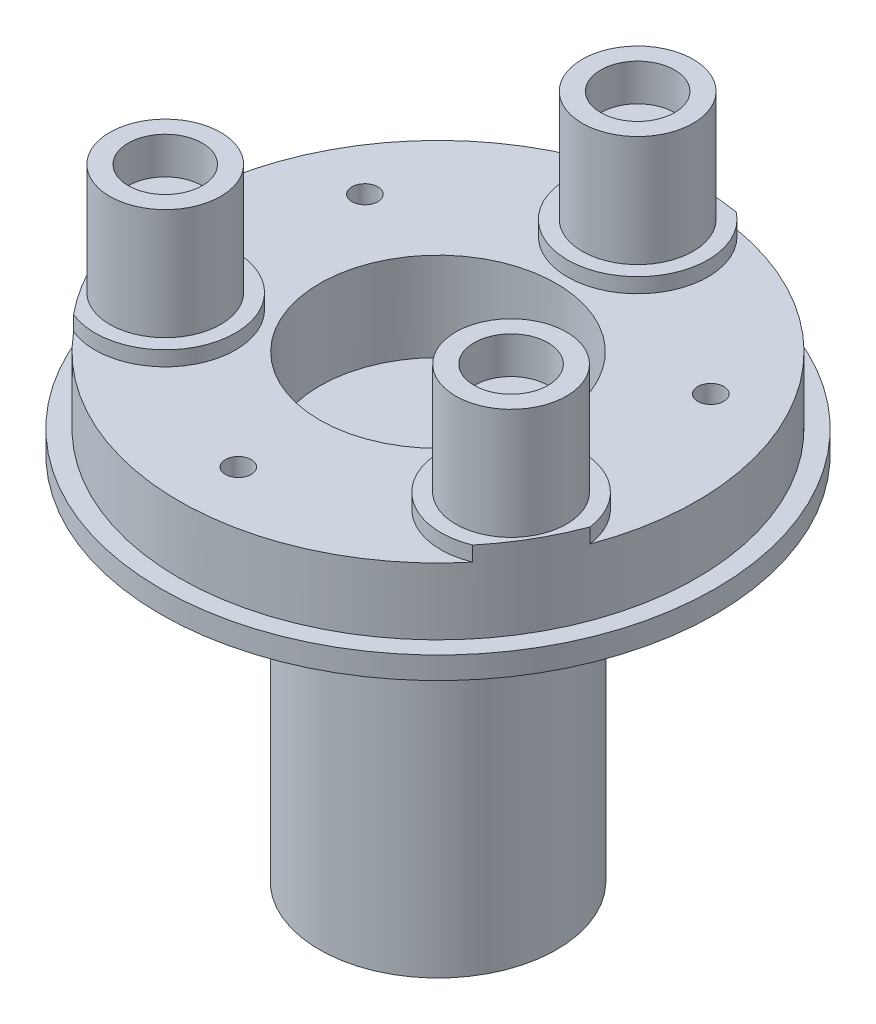
ISO-10303-21;
HEADER;
FILE_DESCRIPTION(('STEP AP214'),'2;1');
FILE_NAME('part.step','',(''),(''),'','','');
FILE_SCHEMA(('AUTOMOTIVE_DESIGN { 1 0 10303 214 1 1 1 1 }'));
ENDSEC;
DATA;
#1=APPLICATION_CONTEXT('core data for automotive mechanical design processes');
#2=APPLICATION_PROTOCOL_DEFINITION('international standard','automotive_design',2000,#1);
#3=PRODUCT_CONTEXT('',#1,'mechanical');
#4=PRODUCT('Part','Part','',(#3));
#5=PRODUCT_RELATED_PRODUCT_CATEGORY('part','',(#4));
#6=PRODUCT_DEFINITION_FORMATION('','',#4);
#7=PRODUCT_DEFINITION_CONTEXT('part definition',#1,'design');
#8=PRODUCT_DEFINITION('design','',#6,#7);
#9=PRODUCT_DEFINITION_SHAPE('','',#8);
#10=(LENGTH_UNIT() NAMED_UNIT(*) SI_UNIT(.MILLI.,.METRE.));
#11=(NAMED_UNIT(*) PLANE_ANGLE_UNIT() SI_UNIT($,.RADIAN.));
#12=(NAMED_UNIT(*) SI_UNIT($,.STERADIAN.) SOLID_ANGLE_UNIT());
#13=UNCERTAINTY_MEASURE_WITH_UNIT(LENGTH_MEASURE(1.E-05),#10,'distance_accuracy_value','');
#14=(GEOMETRIC_REPRESENTATION_CONTEXT(3) GLOBAL_UNCERTAINTY_ASSIGNED_CONTEXT((#13)) GLOBAL_UNIT_ASSIGNED_CONTEXT((#10,
#11,#12)) REPRESENTATION_CONTEXT('',''));
#15=CARTESIAN_POINT('',(0.,0.,0.));
#16=DIRECTION('',(0.,0.,1.));
#17=DIRECTION('',(1.,0.,0.));
#18=AXIS2_PLACEMENT_3D('',#15,#16,#17);
#19=CARTESIAN_POINT('',(0.,0.,0.));
#20=DIRECTION('',(0.,1.,0.));
#21=DIRECTION('',(0.,0.,1.));
#22=AXIS2_PLACEMENT_3D('',#19,#20,#21);
#23=CYLINDRICAL_SURFACE('',#22,16.);
#24=CARTESIAN_POINT('',(0.,12.,0.));
#25=DIRECTION('',(0.,1.,0.));
#26=DIRECTION('',(0.,0.,1.));
#27=AXIS2_PLACEMENT_3D('',#24,#25,#26);
#28=CIRCLE('',#27,16.);
#29=CARTESIAN_POINT('',(0.,12.,16.));
#30=VERTEX_POINT('',#29);
#31=EDGE_CURVE('E135',#30,#30,#28,.T.);
#32=ORIENTED_EDGE('',*,*,#31,.T.);
#33=EDGE_LOOP('',(#32));
#34=FACE_BOUND('',#33,.T.);
#35=CARTESIAN_POINT('',(0.,0.,0.));
#36=DIRECTION('',(0.,-1.,0.));
#37=DIRECTION('',(0.,0.,-1.));
#38=AXIS2_PLACEMENT_3D('',#35,#36,#37);
#39=CIRCLE('',#38,16.);
#40=CARTESIAN_POINT('',(0.,0.,-16.));
#41=VERTEX_POINT('',#40);
#42=EDGE_CURVE('E11',#41,#41,#39,.F.);
#43=ORIENTED_EDGE('',*,*,#42,.F.);
#44=EDGE_LOOP('',(#43));
#45=FACE_BOUND('',#44,.T.);
#46=ADVANCED_FACE('F37',(#34,#45),#23,.F.);
#47=CARTESIAN_POINT('',(0.,0.,0.));
#48=DIRECTION('',(0.,1.,0.));
#49=DIRECTION('',(0.,0.,1.));
#50=AXIS2_PLACEMENT_3D('',#47,#48,#49);
#51=PLANE('',#50);
#52=CARTESIAN_POINT('',(0.,0.,0.));
#53=DIRECTION('',(0.,1.,0.));
#54=DIRECTION('',(0.,0.,1.));
#55=AXIS2_PLACEMENT_3D('',#52,#53,#54);
#56=CIRCLE('',#55,37.5);
#57=CARTESIAN_POINT('',(0.,0.,37.5));
#58=VERTEX_POINT('',#57);
#59=EDGE_CURVE('E145',#58,#58,#56,.T.);
#60=ORIENTED_EDGE('',*,*,#59,.F.);
#61=EDGE_LOOP('',(#60));
#62=FACE_BOUND('',#61,.T.);
#63=CARTESIAN_POINT('',(23.3826859021781,0.,13.500000000001));
#64=DIRECTION('',(0.,-1.,0.));
#65=DIRECTION('',(0.,0.,-1.));
#66=AXIS2_PLACEMENT_3D('',#63,#64,#65);
#67=CIRCLE('',#66,3.525);
#68=CARTESIAN_POINT('',(23.3826859021781,0.,9.97500000000099));
#69=VERTEX_POINT('',#68);
#70=EDGE_CURVE('E159',#69,#69,#67,.T.);
#71=ORIENTED_EDGE('',*,*,#70,.F.);
#72=EDGE_LOOP('',(#71));
#73=FACE_BOUND('',#72,.T.);
#74=CARTESIAN_POINT('',(-23.3826859021816,0.,13.499999999999));
#75=DIRECTION('',(0.,-1.,0.));
#76=DIRECTION('',(0.,0.,-1.));
#77=AXIS2_PLACEMENT_3D('',#74,#75,#76);
#78=CIRCLE('',#77,3.525);
#79=CARTESIAN_POINT('',(-23.3826859021816,0.,9.974999999999));
#80=VERTEX_POINT('',#79);
#81=EDGE_CURVE('E164',#80,#80,#78,.T.);
#82=ORIENTED_EDGE('',*,*,#81,.F.);
#83=EDGE_LOOP('',(#82));
#84=FACE_BOUND('',#83,.T.);
#85=CARTESIAN_POINT('',(0.,0.,-27.));
#86=DIRECTION('',(0.,-1.,0.));
#87=DIRECTION('',(0.,0.,-1.));
#88=AXIS2_PLACEMENT_3D('',#85,#86,#87);
#89=CIRCLE('',#88,3.525);
#90=CARTESIAN_POINT('',(0.,0.,-30.525));
#91=VERTEX_POINT('',#90);
#92=EDGE_CURVE('E184',#91,#91,#89,.T.);
#93=ORIENTED_EDGE('',*,*,#92,.F.);
#94=EDGE_LOOP('',(#93));
#95=FACE_BOUND('',#94,.T.);
#96=CARTESIAN_POINT('',(-23.3826859021798,0.,-13.4999999999981));
#97=DIRECTION('',(0.,1.,0.));
#98=DIRECTION('',(0.,0.,1.));
#99=AXIS2_PLACEMENT_3D('',#96,#97,#98);
#100=CIRCLE('',#99,1.75);
#101=CARTESIAN_POINT('',(-23.3826859021798,0.,-11.7499999999981));
#102=VERTEX_POINT('',#101);
#103=EDGE_CURVE('E194',#102,#102,#100,.T.);
#104=ORIENTED_EDGE('',*,*,#103,.T.);
#105=EDGE_LOOP('',(#104));
#106=FACE_BOUND('',#105,.T.);
#107=CARTESIAN_POINT('',(1.62490074036202E-12,0.,27.000000000001));
#108=DIRECTION('',(0.,1.,0.));
#109=DIRECTION('',(0.,0.,1.));
#110=AXIS2_PLACEMENT_3D('',#107,#108,#109);
#111=CIRCLE('',#110,1.75);
#112=CARTESIAN_POINT('',(1.62490074036202E-12,0.,28.750000000001));
#113=VERTEX_POINT('',#112);
#114=EDGE_CURVE('E188',#113,#113,#111,.T.);
#115=ORIENTED_EDGE('',*,*,#114,.T.);
#116=EDGE_LOOP('',(#115));
#117=FACE_BOUND('',#116,.T.);
#118=CARTESIAN_POINT('',(23.3826859021799,0.,-13.4999999999999));
#119=DIRECTION('',(0.,1.,0.));
#120=DIRECTION('',(0.,0.,1.));
#121=AXIS2_PLACEMENT_3D('',#118,#119,#120);
#122=CIRCLE('',#121,1.75);
#123=CARTESIAN_POINT('',(23.3826859021799,0.,-11.7499999999999));
#124=VERTEX_POINT('',#123);
#125=EDGE_CURVE('E181',#124,#124,#122,.T.);
#126=ORIENTED_EDGE('',*,*,#125,.T.);
#127=EDGE_LOOP('',(#126));
#128=FACE_BOUND('',#127,.T.);
#129=CARTESIAN_POINT('',(0.,0.,0.));
#130=DIRECTION('',(0.,1.,0.));
#131=DIRECTION('',(0.,0.,1.));
#132=AXIS2_PLACEMENT_3D('',#129,#130,#131);
#133=CIRCLE('',#132,18.);
#134=CARTESIAN_POINT('',(0.,0.,18.));
#135=VERTEX_POINT('',#134);
#136=EDGE_CURVE('E45',#135,#135,#133,.F.);
#137=ORIENTED_EDGE('',*,*,#136,.F.);
#138=EDGE_LOOP('',(#137));
#139=FACE_BOUND('',#138,.T.);
#140=ADVANCED_FACE('F287',(#62,#73,#84,#95,#106,#117,#128,#139),#51,.F.);
#141=CARTESIAN_POINT('',(0.,3.,0.));
#142=DIRECTION('',(0.,-1.,0.));
#143=DIRECTION('',(0.,0.,-1.));
#144=AXIS2_PLACEMENT_3D('',#141,#142,#143);
#145=CYLINDRICAL_SURFACE('',#144,37.5);
#146=CARTESIAN_POINT('',(0.,3.,0.));
#147=DIRECTION('',(0.,1.,0.));
#148=DIRECTION('',(0.,0.,1.));
#149=AXIS2_PLACEMENT_3D('',#146,#147,#148);
#150=CIRCLE('',#149,37.5);
#151=CARTESIAN_POINT('',(0.,3.,37.5));
#152=VERTEX_POINT('',#151);
#153=EDGE_CURVE('E146',#152,#152,#150,.T.);
#154=ORIENTED_EDGE('',*,*,#153,.F.);
#155=EDGE_LOOP('',(#154));
#156=FACE_BOUND('',#155,.T.);
#157=ORIENTED_EDGE('',*,*,#59,.T.);
#158=EDGE_LOOP('',(#157));
#159=FACE_BOUND('',#158,.T.);
#160=ADVANCED_FACE('F39',(#156,#159),#145,.T.);
#161=CARTESIAN_POINT('',(0.,3.,0.));
#162=DIRECTION('',(0.,1.,0.));
#163=DIRECTION('',(0.,0.,1.));
#164=AXIS2_PLACEMENT_3D('',#161,#162,#163);
#165=PLANE('',#164);
#166=CARTESIAN_POINT('',(0.,3.,0.));
#167=DIRECTION('',(0.,1.,0.));
#168=DIRECTION('',(0.,0.,1.));
#169=AXIS2_PLACEMENT_3D('',#166,#167,#168);
#170=CIRCLE('',#169,35.);
#171=CARTESIAN_POINT('',(0.,3.,35.));
#172=VERTEX_POINT('',#171);
#173=EDGE_CURVE('E142',#172,#172,#170,.F.);
#174=ORIENTED_EDGE('',*,*,#173,.T.);
#175=EDGE_LOOP('',(#174));
#176=FACE_BOUND('',#175,.T.);
#177=ORIENTED_EDGE('',*,*,#153,.T.);
#178=EDGE_LOOP('',(#177));
#179=FACE_BOUND('',#178,.T.);
#180=ADVANCED_FACE('F303',(#176,#179),#165,.T.);
#181=CARTESIAN_POINT('',(0.,12.,0.));
#182=DIRECTION('',(0.,-1.,0.));
#183=DIRECTION('',(0.,0.,-1.));
#184=AXIS2_PLACEMENT_3D('',#181,#182,#183);
#185=CYLINDRICAL_SURFACE('',#184,35.);
#186=ORIENTED_EDGE('',*,*,#173,.F.);
#187=EDGE_LOOP('',(#186));
#188=FACE_BOUND('',#187,.T.);
#189=CARTESIAN_POINT('',(0.,12.,0.));
#190=DIRECTION('',(0.,1.,0.));
#191=DIRECTION('',(0.,0.,1.));
#192=AXIS2_PLACEMENT_3D('',#189,#190,#191);
#193=CIRCLE('',#192,35.);
#194=CARTESIAN_POINT('',(-26.9833828527782,12.,22.291187716683));
#195=VERTEX_POINT('',#194);
#196=CARTESIAN_POINT('',(26.983382852779,12.,22.291187716682));
#197=VERTEX_POINT('',#196);
#198=EDGE_CURVE('E139',#195,#197,#193,.T.);
#199=ORIENTED_EDGE('',*,*,#198,.F.);
#200=DIRECTION('',(0.,-1.,0.));
#201=VECTOR('',#200,1.);
#202=CARTESIAN_POINT('',(-26.9833828527782,14.,22.291187716683));
#203=LINE('',#202,#201);
#204=CARTESIAN_POINT('',(-26.9833828527782,14.,22.291187716683));
#205=VERTEX_POINT('',#204);
#206=EDGE_CURVE('E132',#205,#195,#203,.T.);
#207=ORIENTED_EDGE('',*,*,#206,.F.);
#208=CARTESIAN_POINT('',(0.,14.,0.));
#209=DIRECTION('',(0.,1.,0.));
#210=DIRECTION('',(0.,0.,1.));
#211=AXIS2_PLACEMENT_3D('',#208,#209,#210);
#212=CIRCLE('',#211,35.);
#213=CARTESIAN_POINT('',(-32.7964262695624,14.,12.2227011722105));
#214=VERTEX_POINT('',#213);
#215=EDGE_CURVE('E122',#214,#205,#212,.T.);
#216=ORIENTED_EDGE('',*,*,#215,.F.);
#217=DIRECTION('',(0.,-1.,0.));
#218=VECTOR('',#217,1.);
#219=CARTESIAN_POINT('',(-32.7964262695624,14.,12.2227011722105));
#220=LINE('',#219,#218);
#221=CARTESIAN_POINT('',(-32.7964262695624,12.,12.2227011722105));
#222=VERTEX_POINT('',#221);
#223=EDGE_CURVE('E127',#214,#222,#220,.T.);
#224=ORIENTED_EDGE('',*,*,#223,.T.);
#225=CARTESIAN_POINT('',(-5.81304341678534,12.,-34.5138888888889));
#226=VERTEX_POINT('',#225);
#227=EDGE_CURVE('E138',#226,#222,#193,.T.);
#228=ORIENTED_EDGE('',*,*,#227,.F.);
#229=DIRECTION('',(0.,-1.,0.));
#230=VECTOR('',#229,1.);
#231=CARTESIAN_POINT('',(-5.81304341678534,14.,-34.5138888888889));
#232=LINE('',#231,#230);
#233=CARTESIAN_POINT('',(-5.81304341678534,14.,-34.5138888888889));
#234=VERTEX_POINT('',#233);
#235=EDGE_CURVE('E60',#234,#226,#232,.T.);
#236=ORIENTED_EDGE('',*,*,#235,.F.);
#237=CARTESIAN_POINT('',(0.,14.,0.));
#238=DIRECTION('',(0.,1.,0.));
#239=DIRECTION('',(0.,0.,1.));
#240=AXIS2_PLACEMENT_3D('',#237,#238,#239);
#241=CIRCLE('',#240,35.);
#242=CARTESIAN_POINT('',(5.81304341678534,14.,-34.5138888888889));
#243=VERTEX_POINT('',#242);
#244=EDGE_CURVE('E109',#243,#234,#241,.T.);
#245=ORIENTED_EDGE('',*,*,#244,.F.);
#246=DIRECTION('',(0.,-1.,0.));
#247=VECTOR('',#246,1.);
#248=CARTESIAN_POINT('',(5.81304341678534,14.,-34.5138888888889));
#249=LINE('',#248,#247);
#250=CARTESIAN_POINT('',(5.81304341678534,12.,-34.5138888888889));
#251=VERTEX_POINT('',#250);
#252=EDGE_CURVE('E117',#243,#251,#249,.T.);
#253=ORIENTED_EDGE('',*,*,#252,.T.);
#254=CARTESIAN_POINT('',(32.7964262695655,12.,12.2227011722024));
#255=VERTEX_POINT('',#254);
#256=EDGE_CURVE('E106',#255,#251,#193,.T.);
#257=ORIENTED_EDGE('',*,*,#256,.F.);
#258=DIRECTION('',(0.,-1.,0.));
#259=VECTOR('',#258,1.);
#260=CARTESIAN_POINT('',(32.7964262695655,14.,12.2227011722024));
#261=LINE('',#260,#259);
#262=CARTESIAN_POINT('',(32.7964262695655,14.,12.2227011722024));
#263=VERTEX_POINT('',#262);
#264=EDGE_CURVE('E52',#263,#255,#261,.T.);
#265=ORIENTED_EDGE('',*,*,#264,.F.);
#266=CARTESIAN_POINT('',(0.,14.,0.));
#267=DIRECTION('',(0.,1.,0.));
#268=DIRECTION('',(0.,0.,1.));
#269=AXIS2_PLACEMENT_3D('',#266,#267,#268);
#270=CIRCLE('',#269,35.);
#271=CARTESIAN_POINT('',(26.983382852779,14.,22.291187716682));
#272=VERTEX_POINT('',#271);
#273=EDGE_CURVE('E96',#272,#263,#270,.T.);
#274=ORIENTED_EDGE('',*,*,#273,.F.);
#275=DIRECTION('',(0.,-1.,0.));
#276=VECTOR('',#275,1.);
#277=CARTESIAN_POINT('',(26.983382852779,14.,22.291187716682));
#278=LINE('',#277,#276);
#279=EDGE_CURVE('E93',#272,#197,#278,.T.);
#280=ORIENTED_EDGE('',*,*,#279,.T.);
#281=EDGE_LOOP('',(#199,#207,#216,#224,#228,#236,#245,#253,#257,#265,#274,#280));
#282=FACE_BOUND('',#281,.T.);
#283=ADVANCED_FACE('F104',(#188,#282),#185,.T.);
#284=CARTESIAN_POINT('',(0.,12.,0.));
#285=DIRECTION('',(0.,1.,0.));
#286=DIRECTION('',(0.,0.,1.));
#287=AXIS2_PLACEMENT_3D('',#284,#285,#286);
#288=PLANE('',#287);
#289=CARTESIAN_POINT('',(23.3826859021799,12.,-13.4999999999999));
#290=DIRECTION('',(0.,1.,0.));
#291=DIRECTION('',(0.,0.,1.));
#292=AXIS2_PLACEMENT_3D('',#289,#290,#291);
#293=CIRCLE('',#292,1.75);
#294=CARTESIAN_POINT('',(23.3826859021799,12.,-11.7499999999999));
#295=VERTEX_POINT('',#294);
#296=EDGE_CURVE('E185',#295,#295,#293,.T.);
#297=ORIENTED_EDGE('',*,*,#296,.F.);
#298=EDGE_LOOP('',(#297));
#299=FACE_BOUND('',#298,.T.);
#300=CARTESIAN_POINT('',(1.62490074036202E-12,12.,27.000000000001));
#301=DIRECTION('',(0.,1.,0.));
#302=DIRECTION('',(0.,0.,1.));
#303=AXIS2_PLACEMENT_3D('',#300,#301,#302);
#304=CIRCLE('',#303,1.75);
#305=CARTESIAN_POINT('',(1.62490074036202E-12,12.,28.750000000001));
#306=VERTEX_POINT('',#305);
#307=EDGE_CURVE('E191',#306,#306,#304,.T.);
#308=ORIENTED_EDGE('',*,*,#307,.F.);
#309=EDGE_LOOP('',(#308));
#310=FACE_BOUND('',#309,.T.);
#311=CARTESIAN_POINT('',(-23.3826859021798,12.,-13.4999999999981));
#312=DIRECTION('',(0.,1.,0.));
#313=DIRECTION('',(0.,0.,1.));
#314=AXIS2_PLACEMENT_3D('',#311,#312,#313);
#315=CIRCLE('',#314,1.75);
#316=CARTESIAN_POINT('',(-23.3826859021798,12.,-11.7499999999981));
#317=VERTEX_POINT('',#316);
#318=EDGE_CURVE('E174',#317,#317,#315,.T.);
#319=ORIENTED_EDGE('',*,*,#318,.F.);
#320=EDGE_LOOP('',(#319));
#321=FACE_BOUND('',#320,.T.);
#322=ORIENTED_EDGE('',*,*,#198,.T.);
#323=CARTESIAN_POINT('',(23.3826859021818,12.,13.4999999999989));
#324=DIRECTION('',(0.,1.,0.));
#325=DIRECTION('',(0.,0.,1.));
#326=AXIS2_PLACEMENT_3D('',#323,#324,#325);
#327=CIRCLE('',#326,9.5);
#328=EDGE_CURVE('E100',#255,#197,#327,.T.);
#329=ORIENTED_EDGE('',*,*,#328,.F.);
#330=ORIENTED_EDGE('',*,*,#256,.T.);
#331=CARTESIAN_POINT('',(0.,12.,-27.));
#332=DIRECTION('',(0.,1.,0.));
#333=DIRECTION('',(0.,0.,1.));
#334=AXIS2_PLACEMENT_3D('',#331,#332,#333);
#335=CIRCLE('',#334,9.5);
#336=EDGE_CURVE('E107',#226,#251,#335,.T.);
#337=ORIENTED_EDGE('',*,*,#336,.F.);
#338=ORIENTED_EDGE('',*,*,#227,.T.);
#339=CARTESIAN_POINT('',(-23.3826859021779,12.,13.5000000000011));
#340=DIRECTION('',(0.,1.,0.));
#341=DIRECTION('',(0.,0.,1.));
#342=AXIS2_PLACEMENT_3D('',#339,#340,#341);
#343=CIRCLE('',#342,9.50000000000001);
#344=EDGE_CURVE('E121',#195,#222,#343,.T.);
#345=ORIENTED_EDGE('',*,*,#344,.F.);
#346=EDGE_LOOP('',(#322,#329,#330,#337,#338,#345));
#347=FACE_BOUND('',#346,.T.);
#348=ORIENTED_EDGE('',*,*,#31,.F.);
#349=EDGE_LOOP('',(#348));
#350=FACE_BOUND('',#349,.T.);
#351=ADVANCED_FACE('F265',(#299,#310,#321,#347,#350),#288,.T.);
#352=CARTESIAN_POINT('',(-23.3826859021779,14.,13.5000000000011));
#353=DIRECTION('',(0.,-1.,0.));
#354=DIRECTION('',(0.,0.,-1.));
#355=AXIS2_PLACEMENT_3D('',#352,#353,#354);
#356=CYLINDRICAL_SURFACE('',#355,9.50000000000001);
#357=ORIENTED_EDGE('',*,*,#344,.T.);
#358=ORIENTED_EDGE('',*,*,#223,.F.);
#359=CARTESIAN_POINT('',(-23.3826859021779,14.,13.5000000000011));
#360=DIRECTION('',(0.,1.,0.));
#361=DIRECTION('',(0.,0.,1.));
#362=AXIS2_PLACEMENT_3D('',#359,#360,#361);
#363=CIRCLE('',#362,9.50000000000001);
#364=EDGE_CURVE('E125',#205,#214,#363,.T.);
#365=ORIENTED_EDGE('',*,*,#364,.F.);
#366=ORIENTED_EDGE('',*,*,#206,.T.);
#367=EDGE_LOOP('',(#357,#358,#365,#366));
#368=FACE_BOUND('',#367,.T.);
#369=ADVANCED_FACE('F270',(#368),#356,.T.);
#370=CARTESIAN_POINT('',(0.,14.,0.));
#371=DIRECTION('',(0.,1.,0.));
#372=DIRECTION('',(0.,0.,1.));
#373=AXIS2_PLACEMENT_3D('',#370,#371,#372);
#374=PLANE('',#373);
#375=CARTESIAN_POINT('',(-23.3826859021781,14.,13.500000000001));
#376=DIRECTION('',(0.,1.,0.));
#377=DIRECTION('',(0.,0.,1.));
#378=AXIS2_PLACEMENT_3D('',#375,#376,#377);
#379=CIRCLE('',#378,7.50000000000218);
#380=CARTESIAN_POINT('',(-23.3826859021781,14.,21.0000000000032));
#381=VERTEX_POINT('',#380);
#382=EDGE_CURVE('E232',#381,#381,#379,.T.);
#383=ORIENTED_EDGE('',*,*,#382,.F.);
#384=EDGE_LOOP('',(#383));
#385=FACE_BOUND('',#384,.T.);
#386=ORIENTED_EDGE('',*,*,#215,.T.);
#387=ORIENTED_EDGE('',*,*,#364,.T.);
#388=EDGE_LOOP('',(#386,#387));
#389=FACE_BOUND('',#388,.T.);
#390=ADVANCED_FACE('F273',(#385,#389),#374,.T.);
#391=CARTESIAN_POINT('',(0.,14.,-27.));
#392=DIRECTION('',(0.,-1.,0.));
#393=DIRECTION('',(0.,0.,-1.));
#394=AXIS2_PLACEMENT_3D('',#391,#392,#393);
#395=CYLINDRICAL_SURFACE('',#394,9.5);
#396=ORIENTED_EDGE('',*,*,#336,.T.);
#397=ORIENTED_EDGE('',*,*,#252,.F.);
#398=CARTESIAN_POINT('',(0.,14.,-27.));
#399=DIRECTION('',(0.,1.,0.));
#400=DIRECTION('',(0.,0.,1.));
#401=AXIS2_PLACEMENT_3D('',#398,#399,#400);
#402=CIRCLE('',#401,9.5);
#403=EDGE_CURVE('E116',#234,#243,#402,.T.);
#404=ORIENTED_EDGE('',*,*,#403,.F.);
#405=ORIENTED_EDGE('',*,*,#235,.T.);
#406=EDGE_LOOP('',(#396,#397,#404,#405));
#407=FACE_BOUND('',#406,.T.);
#408=ADVANCED_FACE('F275',(#407),#395,.T.);
#409=CARTESIAN_POINT('',(0.,14.,0.));
#410=DIRECTION('',(0.,1.,0.));
#411=DIRECTION('',(0.,0.,1.));
#412=AXIS2_PLACEMENT_3D('',#409,#410,#411);
#413=PLANE('',#412);
#414=CARTESIAN_POINT('',(0.,14.,-27.));
#415=DIRECTION('',(0.,1.,0.));
#416=DIRECTION('',(0.,0.,1.));
#417=AXIS2_PLACEMENT_3D('',#414,#415,#416);
#418=CIRCLE('',#417,7.5);
#419=CARTESIAN_POINT('',(0.,14.,-19.5));
#420=VERTEX_POINT('',#419);
#421=EDGE_CURVE('E256',#420,#420,#418,.T.);
#422=ORIENTED_EDGE('',*,*,#421,.F.);
#423=EDGE_LOOP('',(#422));
#424=FACE_BOUND('',#423,.T.);
#425=ORIENTED_EDGE('',*,*,#244,.T.);
#426=ORIENTED_EDGE('',*,*,#403,.T.);
#427=EDGE_LOOP('',(#425,#426));
#428=FACE_BOUND('',#427,.T.);
#429=ADVANCED_FACE('F282',(#424,#428),#413,.T.);
#430=CARTESIAN_POINT('',(23.3826859021818,14.,13.4999999999989));
#431=DIRECTION('',(0.,-1.,0.));
#432=DIRECTION('',(0.,0.,-1.));
#433=AXIS2_PLACEMENT_3D('',#430,#431,#432);
#434=CYLINDRICAL_SURFACE('',#433,9.5);
#435=ORIENTED_EDGE('',*,*,#328,.T.);
#436=ORIENTED_EDGE('',*,*,#279,.F.);
#437=CARTESIAN_POINT('',(23.3826859021818,14.,13.4999999999989));
#438=DIRECTION('',(0.,1.,0.));
#439=DIRECTION('',(0.,0.,1.));
#440=AXIS2_PLACEMENT_3D('',#437,#438,#439);
#441=CIRCLE('',#440,9.5);
#442=EDGE_CURVE('E89',#263,#272,#441,.T.);
#443=ORIENTED_EDGE('',*,*,#442,.F.);
#444=ORIENTED_EDGE('',*,*,#264,.T.);
#445=EDGE_LOOP('',(#435,#436,#443,#444));
#446=FACE_BOUND('',#445,.T.);
#447=ADVANCED_FACE('F91',(#446),#434,.T.);
#448=CARTESIAN_POINT('',(0.,14.,0.));
#449=DIRECTION('',(0.,1.,0.));
#450=DIRECTION('',(0.,0.,1.));
#451=AXIS2_PLACEMENT_3D('',#448,#449,#450);
#452=PLANE('',#451);
#453=CARTESIAN_POINT('',(23.3826859021816,14.,13.499999999999));
#454=DIRECTION('',(0.,1.,0.));
#455=DIRECTION('',(0.,0.,1.));
#456=AXIS2_PLACEMENT_3D('',#453,#454,#455);
#457=CIRCLE('',#456,7.50000000000147);
#458=CARTESIAN_POINT('',(23.3826859021816,14.,21.0000000000005));
#459=VERTEX_POINT('',#458);
#460=EDGE_CURVE('E250',#459,#459,#457,.T.);
#461=ORIENTED_EDGE('',*,*,#460,.F.);
#462=EDGE_LOOP('',(#461));
#463=FACE_BOUND('',#462,.T.);
#464=ORIENTED_EDGE('',*,*,#273,.T.);
#465=ORIENTED_EDGE('',*,*,#442,.T.);
#466=EDGE_LOOP('',(#464,#465));
#467=FACE_BOUND('',#466,.T.);
#468=ADVANCED_FACE('F98',(#463,#467),#452,.T.);
#469=CARTESIAN_POINT('',(0.,29.,-27.));
#470=DIRECTION('',(0.,-1.,0.));
#471=DIRECTION('',(0.,0.,-1.));
#472=AXIS2_PLACEMENT_3D('',#469,#470,#471);
#473=CYLINDRICAL_SURFACE('',#472,7.5);
#474=CARTESIAN_POINT('',(0.,29.,-27.));
#475=DIRECTION('',(0.,1.,0.));
#476=DIRECTION('',(0.,0.,1.));
#477=AXIS2_PLACEMENT_3D('',#474,#475,#476);
#478=CIRCLE('',#477,7.5);
#479=CARTESIAN_POINT('',(0.,29.,-19.5));
#480=VERTEX_POINT('',#479);
#481=EDGE_CURVE('E259',#480,#480,#478,.T.);
#482=ORIENTED_EDGE('',*,*,#481,.F.);
#483=EDGE_LOOP('',(#482));
#484=FACE_BOUND('',#483,.T.);
#485=ORIENTED_EDGE('',*,*,#421,.T.);
#486=EDGE_LOOP('',(#485));
#487=FACE_BOUND('',#486,.T.);
#488=ADVANCED_FACE('F449',(#484,#487),#473,.T.);
#489=CARTESIAN_POINT('',(0.,29.,-27.));
#490=DIRECTION('',(0.,1.,0.));
#491=DIRECTION('',(0.,0.,1.));
#492=AXIS2_PLACEMENT_3D('',#489,#490,#491);
#493=PLANE('',#492);
#494=CARTESIAN_POINT('',(0.,29.,-27.));
#495=DIRECTION('',(0.,1.,0.));
#496=DIRECTION('',(0.,0.,1.));
#497=AXIS2_PLACEMENT_3D('',#494,#495,#496);
#498=CIRCLE('',#497,5.);
#499=CARTESIAN_POINT('',(0.,29.,-22.));
#500=VERTEX_POINT('',#499);
#501=EDGE_CURVE('E233',#500,#500,#498,.T.);
#502=ORIENTED_EDGE('',*,*,#501,.F.);
#503=EDGE_LOOP('',(#502));
#504=FACE_BOUND('',#503,.T.);
#505=ORIENTED_EDGE('',*,*,#481,.T.);
#506=EDGE_LOOP('',(#505));
#507=FACE_BOUND('',#506,.T.);
#508=ADVANCED_FACE('F445',(#504,#507),#493,.T.);
#509=CARTESIAN_POINT('',(23.3826859021816,29.,13.499999999999));
#510=DIRECTION('',(0.,-1.,0.));
#511=DIRECTION('',(0.,0.,-1.));
#512=AXIS2_PLACEMENT_3D('',#509,#510,#511);
#513=CYLINDRICAL_SURFACE('',#512,7.50000000000147);
#514=CARTESIAN_POINT('',(23.3826859021816,29.,13.499999999999));
#515=DIRECTION('',(0.,1.,0.));
#516=DIRECTION('',(0.,0.,1.));
#517=AXIS2_PLACEMENT_3D('',#514,#515,#516);
#518=CIRCLE('',#517,7.50000000000147);
#519=CARTESIAN_POINT('',(23.3826859021816,29.,21.0000000000005));
#520=VERTEX_POINT('',#519);
#521=EDGE_CURVE('E253',#520,#520,#518,.T.);
#522=ORIENTED_EDGE('',*,*,#521,.F.);
#523=EDGE_LOOP('',(#522));
#524=FACE_BOUND('',#523,.T.);
#525=ORIENTED_EDGE('',*,*,#460,.T.);
#526=EDGE_LOOP('',(#525));
#527=FACE_BOUND('',#526,.T.);
#528=ADVANCED_FACE('F441',(#524,#527),#513,.T.);
#529=CARTESIAN_POINT('',(23.3826859021816,29.,13.499999999999));
#530=DIRECTION('',(0.,1.,0.));
#531=DIRECTION('',(0.,0.,1.));
#532=AXIS2_PLACEMENT_3D('',#529,#530,#531);
#533=PLANE('',#532);
#534=CARTESIAN_POINT('',(23.382685902181,29.,13.4999999999993));
#535=DIRECTION('',(0.,1.,0.));
#536=DIRECTION('',(0.,0.,1.));
#537=AXIS2_PLACEMENT_3D('',#534,#535,#536);
#538=CIRCLE('',#537,5.00000000000102);
#539=CARTESIAN_POINT('',(23.382685902181,29.,18.5000000000004));
#540=VERTEX_POINT('',#539);
#541=EDGE_CURVE('E239',#540,#540,#538,.T.);
#542=ORIENTED_EDGE('',*,*,#541,.F.);
#543=EDGE_LOOP('',(#542));
#544=FACE_BOUND('',#543,.T.);
#545=ORIENTED_EDGE('',*,*,#521,.T.);
#546=EDGE_LOOP('',(#545));
#547=FACE_BOUND('',#546,.T.);
#548=ADVANCED_FACE('F437',(#544,#547),#533,.T.);
#549=CARTESIAN_POINT('',(-23.3826859021781,29.,13.500000000001));
#550=DIRECTION('',(0.,-1.,0.));
#551=DIRECTION('',(0.,0.,-1.));
#552=AXIS2_PLACEMENT_3D('',#549,#550,#551);
#553=CYLINDRICAL_SURFACE('',#552,7.50000000000218);
#554=CARTESIAN_POINT('',(-23.3826859021781,29.,13.500000000001));
#555=DIRECTION('',(0.,1.,0.));
#556=DIRECTION('',(0.,0.,1.));
#557=AXIS2_PLACEMENT_3D('',#554,#555,#556);
#558=CIRCLE('',#557,7.50000000000218);
#559=CARTESIAN_POINT('',(-23.3826859021781,29.,21.0000000000032));
#560=VERTEX_POINT('',#559);
#561=EDGE_CURVE('E247',#560,#560,#558,.T.);
#562=ORIENTED_EDGE('',*,*,#561,.F.);
#563=EDGE_LOOP('',(#562));
#564=FACE_BOUND('',#563,.T.);
#565=ORIENTED_EDGE('',*,*,#382,.T.);
#566=EDGE_LOOP('',(#565));
#567=FACE_BOUND('',#566,.T.);
#568=ADVANCED_FACE('F433',(#564,#567),#553,.T.);
#569=CARTESIAN_POINT('',(-23.3826859021781,29.,13.500000000001));
#570=DIRECTION('',(0.,1.,0.));
#571=DIRECTION('',(0.,0.,1.));
#572=AXIS2_PLACEMENT_3D('',#569,#570,#571);
#573=PLANE('',#572);
#574=CARTESIAN_POINT('',(-23.3826859021787,29.,13.5000000000007));
#575=DIRECTION('',(0.,1.,0.));
#576=DIRECTION('',(0.,0.,1.));
#577=AXIS2_PLACEMENT_3D('',#574,#575,#576);
#578=CIRCLE('',#577,5.00000000000154);
#579=CARTESIAN_POINT('',(-23.3826859021787,29.,18.5000000000022));
#580=VERTEX_POINT('',#579);
#581=EDGE_CURVE('E154',#580,#580,#578,.T.);
#582=ORIENTED_EDGE('',*,*,#581,.F.);
#583=EDGE_LOOP('',(#582));
#584=FACE_BOUND('',#583,.T.);
#585=ORIENTED_EDGE('',*,*,#561,.T.);
#586=EDGE_LOOP('',(#585));
#587=FACE_BOUND('',#586,.T.);
#588=ADVANCED_FACE('F429',(#584,#587),#573,.T.);
#589=CARTESIAN_POINT('',(-23.3826859021787,24.,13.5000000000007));
#590=DIRECTION('',(0.,1.,0.));
#591=DIRECTION('',(0.,0.,1.));
#592=AXIS2_PLACEMENT_3D('',#589,#590,#591);
#593=CYLINDRICAL_SURFACE('',#592,5.00000000000154);
#594=CARTESIAN_POINT('',(-23.3826859021787,24.,13.5000000000007));
#595=DIRECTION('',(0.,1.,0.));
#596=DIRECTION('',(0.,0.,1.));
#597=AXIS2_PLACEMENT_3D('',#594,#595,#596);
#598=CIRCLE('',#597,5.00000000000154);
#599=CARTESIAN_POINT('',(-23.3826859021787,24.,18.5000000000022));
#600=VERTEX_POINT('',#599);
#601=EDGE_CURVE('E242',#600,#600,#598,.T.);
#602=ORIENTED_EDGE('',*,*,#601,.F.);
#603=EDGE_LOOP('',(#602));
#604=FACE_BOUND('',#603,.T.);
#605=ORIENTED_EDGE('',*,*,#581,.T.);
#606=EDGE_LOOP('',(#605));
#607=FACE_BOUND('',#606,.T.);
#608=ADVANCED_FACE('F425',(#604,#607),#593,.F.);
#609=CARTESIAN_POINT('',(-23.3826859021787,24.,13.5000000000007));
#610=DIRECTION('',(0.,1.,0.));
#611=DIRECTION('',(0.,0.,1.));
#612=AXIS2_PLACEMENT_3D('',#609,#610,#611);
#613=PLANE('',#612);
#614=CARTESIAN_POINT('',(-23.3826859021816,24.,13.499999999999));
#615=DIRECTION('',(0.,1.,0.));
#616=DIRECTION('',(0.,0.,1.));
#617=AXIS2_PLACEMENT_3D('',#614,#615,#616);
#618=CIRCLE('',#617,1.8);
#619=CARTESIAN_POINT('',(-23.3826859021816,24.,15.299999999999));
#620=VERTEX_POINT('',#619);
#621=EDGE_CURVE('E156',#620,#620,#618,.T.);
#622=ORIENTED_EDGE('',*,*,#621,.F.);
#623=EDGE_LOOP('',(#622));
#624=FACE_BOUND('',#623,.T.);
#625=ORIENTED_EDGE('',*,*,#601,.T.);
#626=EDGE_LOOP('',(#625));
#627=FACE_BOUND('',#626,.T.);
#628=ADVANCED_FACE('F421',(#624,#627),#613,.T.);
#629=CARTESIAN_POINT('',(23.382685902181,24.,13.4999999999993));
#630=DIRECTION('',(0.,1.,0.));
#631=DIRECTION('',(0.,0.,1.));
#632=AXIS2_PLACEMENT_3D('',#629,#630,#631);
#633=CYLINDRICAL_SURFACE('',#632,5.00000000000102);
#634=CARTESIAN_POINT('',(23.382685902181,24.,13.4999999999993));
#635=DIRECTION('',(0.,1.,0.));
#636=DIRECTION('',(0.,0.,1.));
#637=AXIS2_PLACEMENT_3D('',#634,#635,#636);
#638=CIRCLE('',#637,5.00000000000102);
#639=CARTESIAN_POINT('',(23.382685902181,24.,18.5000000000004));
#640=VERTEX_POINT('',#639);
#641=EDGE_CURVE('E236',#640,#640,#638,.T.);
#642=ORIENTED_EDGE('',*,*,#641,.F.);
#643=EDGE_LOOP('',(#642));
#644=FACE_BOUND('',#643,.T.);
#645=ORIENTED_EDGE('',*,*,#541,.T.);
#646=EDGE_LOOP('',(#645));
#647=FACE_BOUND('',#646,.T.);
#648=ADVANCED_FACE('F417',(#644,#647),#633,.F.);
#649=CARTESIAN_POINT('',(23.382685902181,24.,13.4999999999993));
#650=DIRECTION('',(0.,1.,0.));
#651=DIRECTION('',(0.,0.,1.));
#652=AXIS2_PLACEMENT_3D('',#649,#650,#651);
#653=PLANE('',#652);
#654=CARTESIAN_POINT('',(23.3826859021781,24.,13.500000000001));
#655=DIRECTION('',(0.,1.,0.));
#656=DIRECTION('',(0.,0.,1.));
#657=AXIS2_PLACEMENT_3D('',#654,#655,#656);
#658=CIRCLE('',#657,1.8);
#659=CARTESIAN_POINT('',(23.3826859021781,24.,15.300000000001));
#660=VERTEX_POINT('',#659);
#661=EDGE_CURVE('E151',#660,#660,#658,.T.);
#662=ORIENTED_EDGE('',*,*,#661,.F.);
#663=EDGE_LOOP('',(#662));
#664=FACE_BOUND('',#663,.T.);
#665=ORIENTED_EDGE('',*,*,#641,.T.);
#666=EDGE_LOOP('',(#665));
#667=FACE_BOUND('',#666,.T.);
#668=ADVANCED_FACE('F413',(#664,#667),#653,.T.);
#669=CARTESIAN_POINT('',(0.,24.,-27.));
#670=DIRECTION('',(0.,1.,0.));
#671=DIRECTION('',(0.,0.,1.));
#672=AXIS2_PLACEMENT_3D('',#669,#670,#671);
#673=CYLINDRICAL_SURFACE('',#672,5.);
#674=CARTESIAN_POINT('',(0.,24.,-27.));
#675=DIRECTION('',(0.,1.,0.));
#676=DIRECTION('',(0.,0.,1.));
#677=AXIS2_PLACEMENT_3D('',#674,#675,#676);
#678=CIRCLE('',#677,5.);
#679=CARTESIAN_POINT('',(0.,24.,-22.));
#680=VERTEX_POINT('',#679);
#681=EDGE_CURVE('E229',#680,#680,#678,.T.);
#682=ORIENTED_EDGE('',*,*,#681,.F.);
#683=EDGE_LOOP('',(#682));
#684=FACE_BOUND('',#683,.T.);
#685=ORIENTED_EDGE('',*,*,#501,.T.);
#686=EDGE_LOOP('',(#685));
#687=FACE_BOUND('',#686,.T.);
#688=ADVANCED_FACE('F409',(#684,#687),#673,.F.);
#689=CARTESIAN_POINT('',(0.,24.,-27.));
#690=DIRECTION('',(0.,1.,0.));
#691=DIRECTION('',(0.,0.,1.));
#692=AXIS2_PLACEMENT_3D('',#689,#690,#691);
#693=PLANE('',#692);
#694=CARTESIAN_POINT('',(0.,24.,-27.));
#695=DIRECTION('',(0.,1.,0.));
#696=DIRECTION('',(0.,0.,1.));
#697=AXIS2_PLACEMENT_3D('',#694,#695,#696);
#698=CIRCLE('',#697,1.8);
#699=CARTESIAN_POINT('',(0.,24.,-25.2));
#700=VERTEX_POINT('',#699);
#701=EDGE_CURVE('E161',#700,#700,#698,.T.);
#702=ORIENTED_EDGE('',*,*,#701,.F.);
#703=EDGE_LOOP('',(#702));
#704=FACE_BOUND('',#703,.T.);
#705=ORIENTED_EDGE('',*,*,#681,.T.);
#706=EDGE_LOOP('',(#705));
#707=FACE_BOUND('',#706,.T.);
#708=ADVANCED_FACE('F405',(#704,#707),#693,.T.);
#709=CARTESIAN_POINT('',(23.3826859021781,0.,13.500000000001));
#710=DIRECTION('',(0.,-1.,0.));
#711=DIRECTION('',(0.,0.,-1.));
#712=AXIS2_PLACEMENT_3D('',#709,#710,#711);
#713=CYLINDRICAL_SURFACE('',#712,1.8);
#714=ORIENTED_EDGE('',*,*,#661,.T.);
#715=EDGE_LOOP('',(#714));
#716=FACE_BOUND('',#715,.T.);
#717=CARTESIAN_POINT('',(23.3826859021781,2.4,13.500000000001));
#718=DIRECTION('',(0.,-1.,0.));
#719=DIRECTION('',(0.,0.,-1.));
#720=AXIS2_PLACEMENT_3D('',#717,#718,#719);
#721=CIRCLE('',#720,1.8);
#722=CARTESIAN_POINT('',(23.3826859021781,2.4,11.700000000001));
#723=VERTEX_POINT('',#722);
#724=EDGE_CURVE('E155',#723,#723,#721,.T.);
#725=ORIENTED_EDGE('',*,*,#724,.T.);
#726=EDGE_LOOP('',(#725));
#727=FACE_BOUND('',#726,.T.);
#728=ADVANCED_FACE('F401',(#716,#727),#713,.F.);
#729=CARTESIAN_POINT('',(26.8826859021781,2.4,13.500000000001));
#730=DIRECTION('',(0.,1.,0.));
#731=DIRECTION('',(0.,0.,1.));
#732=AXIS2_PLACEMENT_3D('',#729,#730,#731);
#733=PLANE('',#732);
#734=ORIENTED_EDGE('',*,*,#724,.F.);
#735=EDGE_LOOP('',(#734));
#736=FACE_BOUND('',#735,.T.);
#737=CARTESIAN_POINT('',(23.3826859021781,2.4,13.500000000001));
#738=DIRECTION('',(0.,-1.,0.));
#739=DIRECTION('',(0.,0.,-1.));
#740=AXIS2_PLACEMENT_3D('',#737,#738,#739);
#741=CIRCLE('',#740,3.5);
#742=CARTESIAN_POINT('',(23.3826859021781,2.4,10.000000000001));
#743=VERTEX_POINT('',#742);
#744=EDGE_CURVE('E224',#743,#743,#741,.T.);
#745=ORIENTED_EDGE('',*,*,#744,.T.);
#746=EDGE_LOOP('',(#745));
#747=FACE_BOUND('',#746,.T.);
#748=ADVANCED_FACE('F397',(#736,#747),#733,.F.);
#749=CARTESIAN_POINT('',(23.3826859021781,0.,13.500000000001));
#750=DIRECTION('',(0.,-1.,0.));
#751=DIRECTION('',(0.,0.,-1.));
#752=AXIS2_PLACEMENT_3D('',#749,#750,#751);
#753=CYLINDRICAL_SURFACE('',#752,3.5);
#754=ORIENTED_EDGE('',*,*,#744,.F.);
#755=EDGE_LOOP('',(#754));
#756=FACE_BOUND('',#755,.T.);
#757=CARTESIAN_POINT('',(23.3826859021781,0.0250000000000007,13.500000000001));
#758=DIRECTION('',(0.,-1.,0.));
#759=DIRECTION('',(0.,0.,-1.));
#760=AXIS2_PLACEMENT_3D('',#757,#758,#759);
#761=CIRCLE('',#760,3.5);
#762=CARTESIAN_POINT('',(23.3826859021781,0.0250000000000007,10.000000000001));
#763=VERTEX_POINT('',#762);
#764=EDGE_CURVE('E221',#763,#763,#761,.T.);
#765=ORIENTED_EDGE('',*,*,#764,.T.);
#766=EDGE_LOOP('',(#765));
#767=FACE_BOUND('',#766,.T.);
#768=ADVANCED_FACE('F393',(#756,#767),#753,.F.);
#769=CARTESIAN_POINT('',(23.3826859021781,0.,13.500000000001));
#770=DIRECTION('',(0.,-1.,0.));
#771=DIRECTION('',(0.,0.,-1.));
#772=AXIS2_PLACEMENT_3D('',#769,#770,#771);
#773=CONICAL_SURFACE('',#772,3.525,0.785398163397379);
#774=ORIENTED_EDGE('',*,*,#764,.F.);
#775=EDGE_LOOP('',(#774));
#776=FACE_BOUND('',#775,.T.);
#777=ORIENTED_EDGE('',*,*,#70,.T.);
#778=EDGE_LOOP('',(#777));
#779=FACE_BOUND('',#778,.T.);
#780=ADVANCED_FACE('F389',(#776,#779),#773,.F.);
#781=CARTESIAN_POINT('',(-23.3826859021816,0.,13.499999999999));
#782=DIRECTION('',(0.,-1.,0.));
#783=DIRECTION('',(0.,0.,-1.));
#784=AXIS2_PLACEMENT_3D('',#781,#782,#783);
#785=CYLINDRICAL_SURFACE('',#784,1.8);
#786=ORIENTED_EDGE('',*,*,#621,.T.);
#787=EDGE_LOOP('',(#786));
#788=FACE_BOUND('',#787,.T.);
#789=CARTESIAN_POINT('',(-23.3826859021816,2.4,13.499999999999));
#790=DIRECTION('',(0.,-1.,0.));
#791=DIRECTION('',(0.,0.,-1.));
#792=AXIS2_PLACEMENT_3D('',#789,#790,#791);
#793=CIRCLE('',#792,1.8);
#794=CARTESIAN_POINT('',(-23.3826859021816,2.4,11.699999999999));
#795=VERTEX_POINT('',#794);
#796=EDGE_CURVE('E160',#795,#795,#793,.T.);
#797=ORIENTED_EDGE('',*,*,#796,.T.);
#798=EDGE_LOOP('',(#797));
#799=FACE_BOUND('',#798,.T.);
#800=ADVANCED_FACE('F385',(#788,#799),#785,.F.);
#801=CARTESIAN_POINT('',(-19.8826859021816,2.4,13.499999999999));
#802=DIRECTION('',(0.,1.,0.));
#803=DIRECTION('',(0.,0.,1.));
#804=AXIS2_PLACEMENT_3D('',#801,#802,#803);
#805=PLANE('',#804);
#806=ORIENTED_EDGE('',*,*,#796,.F.);
#807=EDGE_LOOP('',(#806));
#808=FACE_BOUND('',#807,.T.);
#809=CARTESIAN_POINT('',(-23.3826859021816,2.4,13.499999999999));
#810=DIRECTION('',(0.,-1.,0.));
#811=DIRECTION('',(0.,0.,-1.));
#812=AXIS2_PLACEMENT_3D('',#809,#810,#811);
#813=CIRCLE('',#812,3.5);
#814=CARTESIAN_POINT('',(-23.3826859021816,2.4,9.99999999999901));
#815=VERTEX_POINT('',#814);
#816=EDGE_CURVE('E214',#815,#815,#813,.T.);
#817=ORIENTED_EDGE('',*,*,#816,.T.);
#818=EDGE_LOOP('',(#817));
#819=FACE_BOUND('',#818,.T.);
#820=ADVANCED_FACE('F381',(#808,#819),#805,.F.);
#821=CARTESIAN_POINT('',(-23.3826859021816,0.,13.499999999999));
#822=DIRECTION('',(0.,-1.,0.));
#823=DIRECTION('',(0.,0.,-1.));
#824=AXIS2_PLACEMENT_3D('',#821,#822,#823);
#825=CYLINDRICAL_SURFACE('',#824,3.5);
#826=ORIENTED_EDGE('',*,*,#816,.F.);
#827=EDGE_LOOP('',(#826));
#828=FACE_BOUND('',#827,.T.);
#829=CARTESIAN_POINT('',(-23.3826859021816,0.0250000000000007,13.499999999999));
#830=DIRECTION('',(0.,-1.,0.));
#831=DIRECTION('',(0.,0.,-1.));
#832=AXIS2_PLACEMENT_3D('',#829,#830,#831);
#833=CIRCLE('',#832,3.5);
#834=CARTESIAN_POINT('',(-23.3826859021816,0.0250000000000007,9.99999999999901));
#835=VERTEX_POINT('',#834);
#836=EDGE_CURVE('E211',#835,#835,#833,.T.);
#837=ORIENTED_EDGE('',*,*,#836,.T.);
#838=EDGE_LOOP('',(#837));
#839=FACE_BOUND('',#838,.T.);
#840=ADVANCED_FACE('F377',(#828,#839),#825,.F.);
#841=CARTESIAN_POINT('',(-23.3826859021816,0.,13.499999999999));
#842=DIRECTION('',(0.,-1.,0.));
#843=DIRECTION('',(0.,0.,-1.));
#844=AXIS2_PLACEMENT_3D('',#841,#842,#843);
#845=CONICAL_SURFACE('',#844,3.525,0.785398163397379);
#846=ORIENTED_EDGE('',*,*,#836,.F.);
#847=EDGE_LOOP('',(#846));
#848=FACE_BOUND('',#847,.T.);
#849=ORIENTED_EDGE('',*,*,#81,.T.);
#850=EDGE_LOOP('',(#849));
#851=FACE_BOUND('',#850,.T.);
#852=ADVANCED_FACE('F373',(#848,#851),#845,.F.);
#853=CARTESIAN_POINT('',(0.,0.,-27.));
#854=DIRECTION('',(0.,-1.,0.));
#855=DIRECTION('',(0.,0.,-1.));
#856=AXIS2_PLACEMENT_3D('',#853,#854,#855);
#857=CYLINDRICAL_SURFACE('',#856,1.8);
#858=ORIENTED_EDGE('',*,*,#701,.T.);
#859=EDGE_LOOP('',(#858));
#860=FACE_BOUND('',#859,.T.);
#861=CARTESIAN_POINT('',(0.,2.4,-27.));
#862=DIRECTION('',(0.,-1.,0.));
#863=DIRECTION('',(0.,0.,-1.));
#864=AXIS2_PLACEMENT_3D('',#861,#862,#863);
#865=CIRCLE('',#864,1.8);
#866=CARTESIAN_POINT('',(0.,2.4,-28.8));
#867=VERTEX_POINT('',#866);
#868=EDGE_CURVE('E165',#867,#867,#865,.T.);
#869=ORIENTED_EDGE('',*,*,#868,.T.);
#870=EDGE_LOOP('',(#869));
#871=FACE_BOUND('',#870,.T.);
#872=ADVANCED_FACE('F369',(#860,#871),#857,.F.);
#873=CARTESIAN_POINT('',(3.5,2.4,-27.));
#874=DIRECTION('',(0.,1.,0.));
#875=DIRECTION('',(0.,0.,1.));
#876=AXIS2_PLACEMENT_3D('',#873,#874,#875);
#877=PLANE('',#876);
#878=ORIENTED_EDGE('',*,*,#868,.F.);
#879=EDGE_LOOP('',(#878));
#880=FACE_BOUND('',#879,.T.);
#881=CARTESIAN_POINT('',(0.,2.4,-27.));
#882=DIRECTION('',(0.,-1.,0.));
#883=DIRECTION('',(0.,0.,-1.));
#884=AXIS2_PLACEMENT_3D('',#881,#882,#883);
#885=CIRCLE('',#884,3.5);
#886=CARTESIAN_POINT('',(0.,2.4,-30.5));
#887=VERTEX_POINT('',#886);
#888=EDGE_CURVE('E204',#887,#887,#885,.T.);
#889=ORIENTED_EDGE('',*,*,#888,.T.);
#890=EDGE_LOOP('',(#889));
#891=FACE_BOUND('',#890,.T.);
#892=ADVANCED_FACE('F365',(#880,#891),#877,.F.);
#893=CARTESIAN_POINT('',(0.,0.,-27.));
#894=DIRECTION('',(0.,-1.,0.));
#895=DIRECTION('',(0.,0.,-1.));
#896=AXIS2_PLACEMENT_3D('',#893,#894,#895);
#897=CYLINDRICAL_SURFACE('',#896,3.5);
#898=ORIENTED_EDGE('',*,*,#888,.F.);
#899=EDGE_LOOP('',(#898));
#900=FACE_BOUND('',#899,.T.);
#901=CARTESIAN_POINT('',(0.,0.0250000000000007,-27.));
#902=DIRECTION('',(0.,-1.,0.));
#903=DIRECTION('',(0.,0.,-1.));
#904=AXIS2_PLACEMENT_3D('',#901,#902,#903);
#905=CIRCLE('',#904,3.5);
#906=CARTESIAN_POINT('',(0.,0.0250000000000007,-30.5));
#907=VERTEX_POINT('',#906);
#908=EDGE_CURVE('E201',#907,#907,#905,.T.);
#909=ORIENTED_EDGE('',*,*,#908,.T.);
#910=EDGE_LOOP('',(#909));
#911=FACE_BOUND('',#910,.T.);
#912=ADVANCED_FACE('F361',(#900,#911),#897,.F.);
#913=CARTESIAN_POINT('',(0.,0.,-27.));
#914=DIRECTION('',(0.,-1.,0.));
#915=DIRECTION('',(0.,0.,-1.));
#916=AXIS2_PLACEMENT_3D('',#913,#914,#915);
#917=CONICAL_SURFACE('',#916,3.525,0.785398163397388);
#918=ORIENTED_EDGE('',*,*,#908,.F.);
#919=EDGE_LOOP('',(#918));
#920=FACE_BOUND('',#919,.T.);
#921=ORIENTED_EDGE('',*,*,#92,.T.);
#922=EDGE_LOOP('',(#921));
#923=FACE_BOUND('',#922,.T.);
#924=ADVANCED_FACE('F357',(#920,#923),#917,.F.);
#925=CARTESIAN_POINT('',(-23.3826859021798,0.,-13.4999999999981));
#926=DIRECTION('',(0.,1.,0.));
#927=DIRECTION('',(0.,0.,1.));
#928=AXIS2_PLACEMENT_3D('',#925,#926,#927);
#929=CYLINDRICAL_SURFACE('',#928,1.75);
#930=ORIENTED_EDGE('',*,*,#103,.F.);
#931=EDGE_LOOP('',(#930));
#932=FACE_BOUND('',#931,.T.);
#933=ORIENTED_EDGE('',*,*,#318,.T.);
#934=EDGE_LOOP('',(#933));
#935=FACE_BOUND('',#934,.T.);
#936=ADVANCED_FACE('F353',(#932,#935),#929,.F.);
#937=CARTESIAN_POINT('',(1.62490074036202E-12,0.,27.000000000001));
#938=DIRECTION('',(0.,1.,0.));
#939=DIRECTION('',(0.,0.,1.));
#940=AXIS2_PLACEMENT_3D('',#937,#938,#939);
#941=CYLINDRICAL_SURFACE('',#940,1.75);
#942=ORIENTED_EDGE('',*,*,#114,.F.);
#943=EDGE_LOOP('',(#942));
#944=FACE_BOUND('',#943,.T.);
#945=ORIENTED_EDGE('',*,*,#307,.T.);
#946=EDGE_LOOP('',(#945));
#947=FACE_BOUND('',#946,.T.);
#948=ADVANCED_FACE('F349',(#944,#947),#941,.F.);
#949=CARTESIAN_POINT('',(23.3826859021799,0.,-13.4999999999999));
#950=DIRECTION('',(0.,1.,0.));
#951=DIRECTION('',(0.,0.,1.));
#952=AXIS2_PLACEMENT_3D('',#949,#950,#951);
#953=CYLINDRICAL_SURFACE('',#952,1.75);
#954=ORIENTED_EDGE('',*,*,#125,.F.);
#955=EDGE_LOOP('',(#954));
#956=FACE_BOUND('',#955,.T.);
#957=ORIENTED_EDGE('',*,*,#296,.T.);
#958=EDGE_LOOP('',(#957));
#959=FACE_BOUND('',#958,.T.);
#960=ADVANCED_FACE('F342',(#956,#959),#953,.F.);
#961=CARTESIAN_POINT('',(0.,-1.11,0.));
#962=DIRECTION('',(0.,-1.,0.));
#963=DIRECTION('',(0.,0.,-1.));
#964=AXIS2_PLACEMENT_3D('',#961,#962,#963);
#965=PLANE('',#964);
#966=CARTESIAN_POINT('',(0.,-1.11,0.));
#967=DIRECTION('',(0.,-1.,0.));
#968=DIRECTION('',(0.,0.,-1.));
#969=AXIS2_PLACEMENT_3D('',#966,#967,#968);
#970=CIRCLE('',#969,16.05);
#971=CARTESIAN_POINT('',(0.,-1.11,-16.05));
#972=VERTEX_POINT('',#971);
#973=EDGE_CURVE('E167',#972,#972,#970,.F.);
#974=ORIENTED_EDGE('',*,*,#973,.T.);
#975=EDGE_LOOP('',(#974));
#976=FACE_BOUND('',#975,.T.);
#977=CARTESIAN_POINT('',(0.,-1.11,0.));
#978=DIRECTION('',(0.,-1.,0.));
#979=DIRECTION('',(0.,0.,-1.));
#980=AXIS2_PLACEMENT_3D('',#977,#978,#979);
#981=CIRCLE('',#980,18.);
#982=CARTESIAN_POINT('',(0.,-1.11,-18.));
#983=VERTEX_POINT('',#982);
#984=EDGE_CURVE('E169',#983,#983,#981,.T.);
#985=ORIENTED_EDGE('',*,*,#984,.T.);
#986=EDGE_LOOP('',(#985));
#987=FACE_BOUND('',#986,.T.);
#988=ADVANCED_FACE('F334',(#976,#987),#965,.T.);
#989=CARTESIAN_POINT('',(0.,-1.11,0.));
#990=DIRECTION('',(0.,1.,0.));
#991=DIRECTION('',(0.,0.,1.));
#992=AXIS2_PLACEMENT_3D('',#989,#990,#991);
#993=CYLINDRICAL_SURFACE('',#992,18.);
#994=ORIENTED_EDGE('',*,*,#984,.F.);
#995=EDGE_LOOP('',(#994));
#996=FACE_BOUND('',#995,.T.);
#997=ORIENTED_EDGE('',*,*,#136,.T.);
#998=EDGE_LOOP('',(#997));
#999=FACE_BOUND('',#998,.T.);
#1000=ADVANCED_FACE('F331',(#996,#999),#993,.T.);
#1001=CARTESIAN_POINT('',(0.,-50.,0.));
#1002=DIRECTION('',(0.,-1.,0.));
#1003=DIRECTION('',(0.,0.,-1.));
#1004=AXIS2_PLACEMENT_3D('',#1001,#1002,#1003);
#1005=PLANE('',#1004);
#1006=CARTESIAN_POINT('',(0.,-50.,0.));
#1007=DIRECTION('',(0.,-1.,0.));
#1008=DIRECTION('',(0.,0.,-1.));
#1009=AXIS2_PLACEMENT_3D('',#1006,#1007,#1008);
#1010=CIRCLE('',#1009,16.05);
#1011=CARTESIAN_POINT('',(0.,-50.,-16.05));
#1012=VERTEX_POINT('',#1011);
#1013=EDGE_CURVE('E170',#1012,#1012,#1010,.T.);
#1014=ORIENTED_EDGE('',*,*,#1013,.T.);
#1015=EDGE_LOOP('',(#1014));
#1016=FACE_BOUND('',#1015,.T.);
#1017=ADVANCED_FACE('F333',(#1016),#1005,.T.);
#1018=CARTESIAN_POINT('',(0.,-50.,0.));
#1019=DIRECTION('',(0.,1.,0.));
#1020=DIRECTION('',(0.,0.,1.));
#1021=AXIS2_PLACEMENT_3D('',#1018,#1019,#1020);
#1022=CYLINDRICAL_SURFACE('',#1021,16.05);
#1023=ORIENTED_EDGE('',*,*,#973,.F.);
#1024=EDGE_LOOP('',(#1023));
#1025=FACE_BOUND('',#1024,.T.);
#1026=ORIENTED_EDGE('',*,*,#1013,.F.);
#1027=EDGE_LOOP('',(#1026));
#1028=FACE_BOUND('',#1027,.T.);
#1029=ADVANCED_FACE('F340',(#1025,#1028),#1022,.T.);
#1030=CARTESIAN_POINT('',(0.,0.,0.));
#1031=DIRECTION('',(0.,-1.,0.));
#1032=DIRECTION('',(0.,0.,-1.));
#1033=AXIS2_PLACEMENT_3D('',#1030,#1031,#1032);
#1034=PLANE('',#1033);
#1035=ORIENTED_EDGE('',*,*,#42,.T.);
#1036=EDGE_LOOP('',(#1035));
#1037=FACE_BOUND('',#1036,.T.);
#1038=ADVANCED_FACE('F596',(#1037),#1034,.F.);
#1039=CLOSED_SHELL('',(#46,#140,#160,#180,#283,#351,#369,#390,#408,#429,#447,#468,#488,#508,
#528,#548,#568,#588,#608,#628,#648,#668,#688,#708,#728,#748,#768,#780,#800,#820,#840,#852,#872,
#892,#912,#924,#936,#948,#960,#988,#1000,#1017,#1029,#1038));
#1040=MANIFOLD_SOLID_BREP('B2',#1039);
#1041=ADVANCED_BREP_SHAPE_REPRESENTATION('',(#18,#1040),#14);
#1042=SHAPE_DEFINITION_REPRESENTATION(#9,#1041);
ENDSEC;
END-ISO-10303-21;
